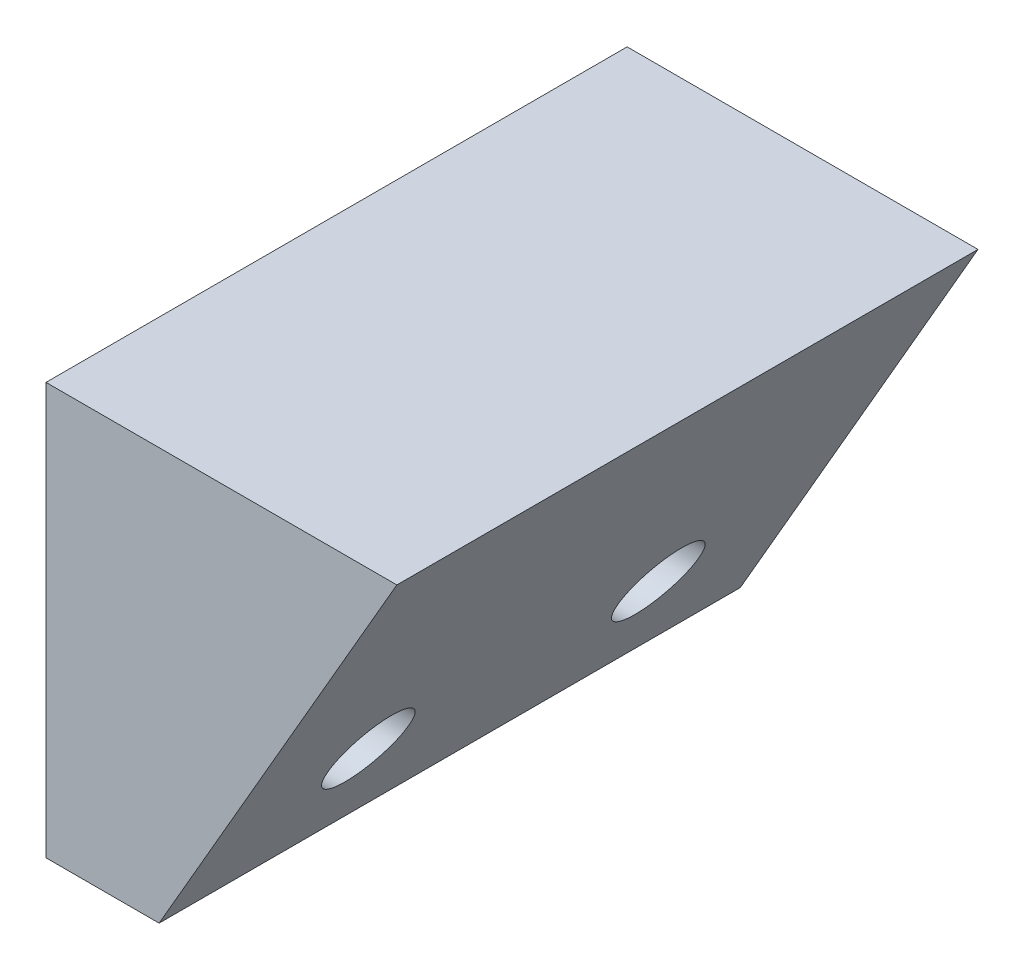
ISO-10303-21;
HEADER;
FILE_DESCRIPTION(('STEP AP214'),'2;1');
FILE_NAME('part.step','',(''),(''),'','','');
FILE_SCHEMA(('AUTOMOTIVE_DESIGN { 1 0 10303 214 1 1 1 1 }'));
ENDSEC;
DATA;
#1=APPLICATION_CONTEXT('core data for automotive mechanical design processes');
#2=APPLICATION_PROTOCOL_DEFINITION('international standard','automotive_design',2000,#1);
#3=PRODUCT_CONTEXT('',#1,'mechanical');
#4=PRODUCT('Part','Part','',(#3));
#5=PRODUCT_RELATED_PRODUCT_CATEGORY('part','',(#4));
#6=PRODUCT_DEFINITION_FORMATION('','',#4);
#7=PRODUCT_DEFINITION_CONTEXT('part definition',#1,'design');
#8=PRODUCT_DEFINITION('design','',#6,#7);
#9=PRODUCT_DEFINITION_SHAPE('','',#8);
#10=(LENGTH_UNIT() NAMED_UNIT(*) SI_UNIT(.MILLI.,.METRE.));
#11=(NAMED_UNIT(*) PLANE_ANGLE_UNIT() SI_UNIT($,.RADIAN.));
#12=(NAMED_UNIT(*) SI_UNIT($,.STERADIAN.) SOLID_ANGLE_UNIT());
#13=UNCERTAINTY_MEASURE_WITH_UNIT(LENGTH_MEASURE(1.E-05),#10,'distance_accuracy_value','');
#14=(GEOMETRIC_REPRESENTATION_CONTEXT(3) GLOBAL_UNCERTAINTY_ASSIGNED_CONTEXT((#13)) GLOBAL_UNIT_ASSIGNED_CONTEXT((#10,
#11,#12)) REPRESENTATION_CONTEXT('',''));
#15=CARTESIAN_POINT('',(0.,0.,0.));
#16=DIRECTION('',(0.,0.,1.));
#17=DIRECTION('',(1.,0.,0.));
#18=AXIS2_PLACEMENT_3D('',#15,#16,#17);
#19=CARTESIAN_POINT('',(-30.1282751716005,-3.72508897386453,18.4290506563316));
#20=DIRECTION('',(0.,0.,-1.));
#21=DIRECTION('',(-1.,0.,0.));
#22=AXIS2_PLACEMENT_3D('',#19,#20,#21);
#23=PLANE('',#22);
#24=DIRECTION('',(0.500000000000004,0.866025403784436,0.));
#25=VECTOR('',#24,1.);
#26=CARTESIAN_POINT('',(-40.3762424497165,-21.4750889738645,18.4290506563316));
#27=LINE('',#26,#25);
#28=CARTESIAN_POINT('',(-40.3762424497165,-21.4750889738645,18.4290506563316));
#29=VERTEX_POINT('',#28);
#30=CARTESIAN_POINT('',(-30.1282751716005,-3.72508897386453,18.4290506563316));
#31=VERTEX_POINT('',#30);
#32=EDGE_CURVE('E41',#29,#31,#27,.T.);
#33=ORIENTED_EDGE('',*,*,#32,.F.);
#34=DIRECTION('',(1.,0.,0.));
#35=VECTOR('',#34,1.);
#36=CARTESIAN_POINT('',(-45.2522588106585,-21.4750889738645,18.4290506563316));
#37=LINE('',#36,#35);
#38=CARTESIAN_POINT('',(-45.2522588106585,-21.4750889738645,18.4290506563316));
#39=VERTEX_POINT('',#38);
#40=EDGE_CURVE('E65',#39,#29,#37,.T.);
#41=ORIENTED_EDGE('',*,*,#40,.F.);
#42=DIRECTION('',(0.,-1.,0.));
#43=VECTOR('',#42,1.);
#44=CARTESIAN_POINT('',(-45.2522588106585,-3.72508897386453,18.4290506563316));
#45=LINE('',#44,#43);
#46=CARTESIAN_POINT('',(-45.2522588106585,-3.72508897386453,18.4290506563316));
#47=VERTEX_POINT('',#46);
#48=EDGE_CURVE('E70',#47,#39,#45,.T.);
#49=ORIENTED_EDGE('',*,*,#48,.F.);
#50=DIRECTION('',(-1.,0.,0.));
#51=VECTOR('',#50,1.);
#52=CARTESIAN_POINT('',(-30.1282751716005,-3.72508897386453,18.4290506563316));
#53=LINE('',#52,#51);
#54=EDGE_CURVE('E85',#31,#47,#53,.T.);
#55=ORIENTED_EDGE('',*,*,#54,.F.);
#56=EDGE_LOOP('',(#33,#41,#49,#55));
#57=FACE_BOUND('',#56,.T.);
#58=ADVANCED_FACE('F32',(#57),#23,.T.);
#59=CARTESIAN_POINT('',(0.,0.,43.4790506563316));
#60=DIRECTION('',(0.,0.,1.));
#61=DIRECTION('',(1.,0.,0.));
#62=AXIS2_PLACEMENT_3D('',#59,#60,#61);
#63=PLANE('',#62);
#64=DIRECTION('',(0.500000000000004,0.866025403784436,0.));
#65=VECTOR('',#64,1.);
#66=CARTESIAN_POINT('',(-40.3762424497165,-21.4750889738645,43.4790506563316));
#67=LINE('',#66,#65);
#68=CARTESIAN_POINT('',(-40.3762424497165,-21.4750889738645,43.4790506563316));
#69=VERTEX_POINT('',#68);
#70=CARTESIAN_POINT('',(-30.1282751716005,-3.72508897386453,43.4790506563316));
#71=VERTEX_POINT('',#70);
#72=EDGE_CURVE('E95',#69,#71,#67,.T.);
#73=ORIENTED_EDGE('',*,*,#72,.T.);
#74=DIRECTION('',(-1.,0.,0.));
#75=VECTOR('',#74,1.);
#76=CARTESIAN_POINT('',(-30.1282751716005,-3.72508897386453,43.4790506563316));
#77=LINE('',#76,#75);
#78=CARTESIAN_POINT('',(-45.2522588106585,-3.72508897386453,43.4790506563316));
#79=VERTEX_POINT('',#78);
#80=EDGE_CURVE('E83',#71,#79,#77,.T.);
#81=ORIENTED_EDGE('',*,*,#80,.T.);
#82=DIRECTION('',(0.,-1.,0.));
#83=VECTOR('',#82,1.);
#84=CARTESIAN_POINT('',(-45.2522588106585,-3.72508897386453,43.4790506563316));
#85=LINE('',#84,#83);
#86=CARTESIAN_POINT('',(-45.2522588106585,-21.4750889738645,43.4790506563316));
#87=VERTEX_POINT('',#86);
#88=EDGE_CURVE('E87',#79,#87,#85,.T.);
#89=ORIENTED_EDGE('',*,*,#88,.T.);
#90=DIRECTION('',(1.,0.,0.));
#91=VECTOR('',#90,1.);
#92=CARTESIAN_POINT('',(-45.2522588106585,-21.4750889738645,43.4790506563316));
#93=LINE('',#92,#91);
#94=EDGE_CURVE('E92',#87,#69,#93,.T.);
#95=ORIENTED_EDGE('',*,*,#94,.T.);
#96=EDGE_LOOP('',(#73,#81,#89,#95));
#97=FACE_BOUND('',#96,.T.);
#98=ADVANCED_FACE('F94',(#97),#63,.T.);
#99=CARTESIAN_POINT('',(-30.1282751716005,-3.72508897386453,-4.8904129119946));
#100=DIRECTION('',(0.,1.,0.));
#101=DIRECTION('',(-1.,0.,0.));
#102=AXIS2_PLACEMENT_3D('',#99,#100,#101);
#103=PLANE('',#102);
#104=DIRECTION('',(0.,0.,1.));
#105=VECTOR('',#104,1.);
#106=CARTESIAN_POINT('',(-30.1282751716005,-3.72508897386453,-4.8904129119946));
#107=LINE('',#106,#105);
#108=EDGE_CURVE('E11',#31,#71,#107,.T.);
#109=ORIENTED_EDGE('',*,*,#108,.F.);
#110=ORIENTED_EDGE('',*,*,#54,.T.);
#111=DIRECTION('',(0.,0.,1.));
#112=VECTOR('',#111,1.);
#113=CARTESIAN_POINT('',(-45.2522588106585,-3.72508897386453,-4.8904129119946));
#114=LINE('',#113,#112);
#115=EDGE_CURVE('E80',#47,#79,#114,.T.);
#116=ORIENTED_EDGE('',*,*,#115,.T.);
#117=ORIENTED_EDGE('',*,*,#80,.F.);
#118=EDGE_LOOP('',(#109,#110,#116,#117));
#119=FACE_BOUND('',#118,.T.);
#120=ADVANCED_FACE('F81',(#119),#103,.T.);
#121=CARTESIAN_POINT('',(-45.2522588106585,-3.72508897386453,-4.8904129119946));
#122=DIRECTION('',(-1.,0.,0.));
#123=DIRECTION('',(0.,0.,1.));
#124=AXIS2_PLACEMENT_3D('',#121,#122,#123);
#125=PLANE('',#124);
#126=CARTESIAN_POINT('',(-45.2522588106585,-16.7250889738645,24.7040506563316));
#127=DIRECTION('',(-1.,0.,0.));
#128=DIRECTION('',(0.,0.,1.));
#129=AXIS2_PLACEMENT_3D('',#126,#127,#128);
#130=CIRCLE('',#129,1.75);
#131=CARTESIAN_POINT('',(-45.2522588106585,-16.7250889738645,26.4540506563316));
#132=VERTEX_POINT('',#131);
#133=EDGE_CURVE('E116',#132,#132,#130,.T.);
#134=ORIENTED_EDGE('',*,*,#133,.F.);
#135=EDGE_LOOP('',(#134));
#136=FACE_BOUND('',#135,.T.);
#137=CARTESIAN_POINT('',(-45.2522588106585,-16.7250889738645,37.2040506563316));
#138=DIRECTION('',(-1.,0.,0.));
#139=DIRECTION('',(0.,0.,1.));
#140=AXIS2_PLACEMENT_3D('',#137,#138,#139);
#141=CIRCLE('',#140,1.75);
#142=CARTESIAN_POINT('',(-45.2522588106585,-16.7250889738645,38.9540506563316));
#143=VERTEX_POINT('',#142);
#144=EDGE_CURVE('E108',#143,#143,#141,.T.);
#145=ORIENTED_EDGE('',*,*,#144,.F.);
#146=EDGE_LOOP('',(#145));
#147=FACE_BOUND('',#146,.T.);
#148=ORIENTED_EDGE('',*,*,#115,.F.);
#149=ORIENTED_EDGE('',*,*,#48,.T.);
#150=DIRECTION('',(0.,0.,1.));
#151=VECTOR('',#150,1.);
#152=CARTESIAN_POINT('',(-45.2522588106585,-21.4750889738645,-4.8904129119946));
#153=LINE('',#152,#151);
#154=EDGE_CURVE('E75',#39,#87,#153,.T.);
#155=ORIENTED_EDGE('',*,*,#154,.T.);
#156=ORIENTED_EDGE('',*,*,#88,.F.);
#157=EDGE_LOOP('',(#148,#149,#155,#156));
#158=FACE_BOUND('',#157,.T.);
#159=ADVANCED_FACE('F88',(#136,#147,#158),#125,.T.);
#160=CARTESIAN_POINT('',(-45.2522588106585,-21.4750889738645,-4.8904129119946));
#161=DIRECTION('',(0.,-1.,0.));
#162=DIRECTION('',(0.,0.,-1.));
#163=AXIS2_PLACEMENT_3D('',#160,#161,#162);
#164=PLANE('',#163);
#165=ORIENTED_EDGE('',*,*,#154,.F.);
#166=ORIENTED_EDGE('',*,*,#40,.T.);
#167=DIRECTION('',(0.,0.,1.));
#168=VECTOR('',#167,1.);
#169=CARTESIAN_POINT('',(-40.3762424497165,-21.4750889738645,-4.8904129119946));
#170=LINE('',#169,#168);
#171=EDGE_CURVE('E103',#29,#69,#170,.T.);
#172=ORIENTED_EDGE('',*,*,#171,.T.);
#173=ORIENTED_EDGE('',*,*,#94,.F.);
#174=EDGE_LOOP('',(#165,#166,#172,#173));
#175=FACE_BOUND('',#174,.T.);
#176=ADVANCED_FACE('F119',(#175),#164,.T.);
#177=CARTESIAN_POINT('',(-40.3762424497165,-21.4750889738645,-4.8904129119946));
#178=DIRECTION('',(0.866025403784436,-0.500000000000004,0.));
#179=DIRECTION('',(0.500000000000004,0.866025403784436,0.));
#180=AXIS2_PLACEMENT_3D('',#177,#178,#179);
#181=PLANE('',#180);
#182=CARTESIAN_POINT('',(-37.6338286710658,-16.7250889738645,24.7040506563316));
#183=DIRECTION('',(0.866025403784436,-0.500000000000004,0.));
#184=DIRECTION('',(-0.500000000000004,-0.866025403784436,0.));
#185=AXIS2_PLACEMENT_3D('',#182,#183,#184);
#186=ELLIPSE('',#185,2.0207259421637,1.75);
#187=CARTESIAN_POINT('',(-38.6441916421476,-18.4750889738645,24.7040506563316));
#188=VERTEX_POINT('',#187);
#189=EDGE_CURVE('E35',#188,#188,#186,.T.);
#190=ORIENTED_EDGE('',*,*,#189,.F.);
#191=EDGE_LOOP('',(#190));
#192=FACE_BOUND('',#191,.T.);
#193=CARTESIAN_POINT('',(-37.6338286710658,-16.7250889738645,37.2040506563316));
#194=DIRECTION('',(0.866025403784436,-0.500000000000004,0.));
#195=DIRECTION('',(-0.500000000000004,-0.866025403784436,0.));
#196=AXIS2_PLACEMENT_3D('',#193,#194,#195);
#197=ELLIPSE('',#196,2.02072594216369,1.75);
#198=CARTESIAN_POINT('',(-38.6441916421476,-18.4750889738645,37.2040506563316));
#199=VERTEX_POINT('',#198);
#200=EDGE_CURVE('E97',#199,#199,#197,.T.);
#201=ORIENTED_EDGE('',*,*,#200,.F.);
#202=EDGE_LOOP('',(#201));
#203=FACE_BOUND('',#202,.T.);
#204=ORIENTED_EDGE('',*,*,#171,.F.);
#205=ORIENTED_EDGE('',*,*,#32,.T.);
#206=ORIENTED_EDGE('',*,*,#108,.T.);
#207=ORIENTED_EDGE('',*,*,#72,.F.);
#208=EDGE_LOOP('',(#204,#205,#206,#207));
#209=FACE_BOUND('',#208,.T.);
#210=ADVANCED_FACE('F121',(#192,#203,#209),#181,.T.);
#211=CARTESIAN_POINT('',(-15.1282751716005,-16.7250889738645,37.2040506563316));
#212=DIRECTION('',(-1.,0.,0.));
#213=DIRECTION('',(0.,0.,1.));
#214=AXIS2_PLACEMENT_3D('',#211,#212,#213);
#215=CYLINDRICAL_SURFACE('',#214,1.75);
#216=ORIENTED_EDGE('',*,*,#200,.T.);
#217=EDGE_LOOP('',(#216));
#218=FACE_BOUND('',#217,.T.);
#219=ORIENTED_EDGE('',*,*,#144,.T.);
#220=EDGE_LOOP('',(#219));
#221=FACE_BOUND('',#220,.T.);
#222=ADVANCED_FACE('F123',(#218,#221),#215,.F.);
#223=CARTESIAN_POINT('',(-15.1282751716005,-16.7250889738645,24.7040506563316));
#224=DIRECTION('',(-1.,0.,0.));
#225=DIRECTION('',(0.,0.,1.));
#226=AXIS2_PLACEMENT_3D('',#223,#224,#225);
#227=CYLINDRICAL_SURFACE('',#226,1.75);
#228=ORIENTED_EDGE('',*,*,#189,.T.);
#229=EDGE_LOOP('',(#228));
#230=FACE_BOUND('',#229,.T.);
#231=ORIENTED_EDGE('',*,*,#133,.T.);
#232=EDGE_LOOP('',(#231));
#233=FACE_BOUND('',#232,.T.);
#234=ADVANCED_FACE('F130',(#230,#233),#227,.F.);
#235=CLOSED_SHELL('',(#58,#98,#120,#159,#176,#210,#222,#234));
#236=MANIFOLD_SOLID_BREP('B2',#235);
#237=ADVANCED_BREP_SHAPE_REPRESENTATION('',(#18,#236),#14);
#238=SHAPE_DEFINITION_REPRESENTATION(#9,#237);
ENDSEC;
END-ISO-10303-21;
